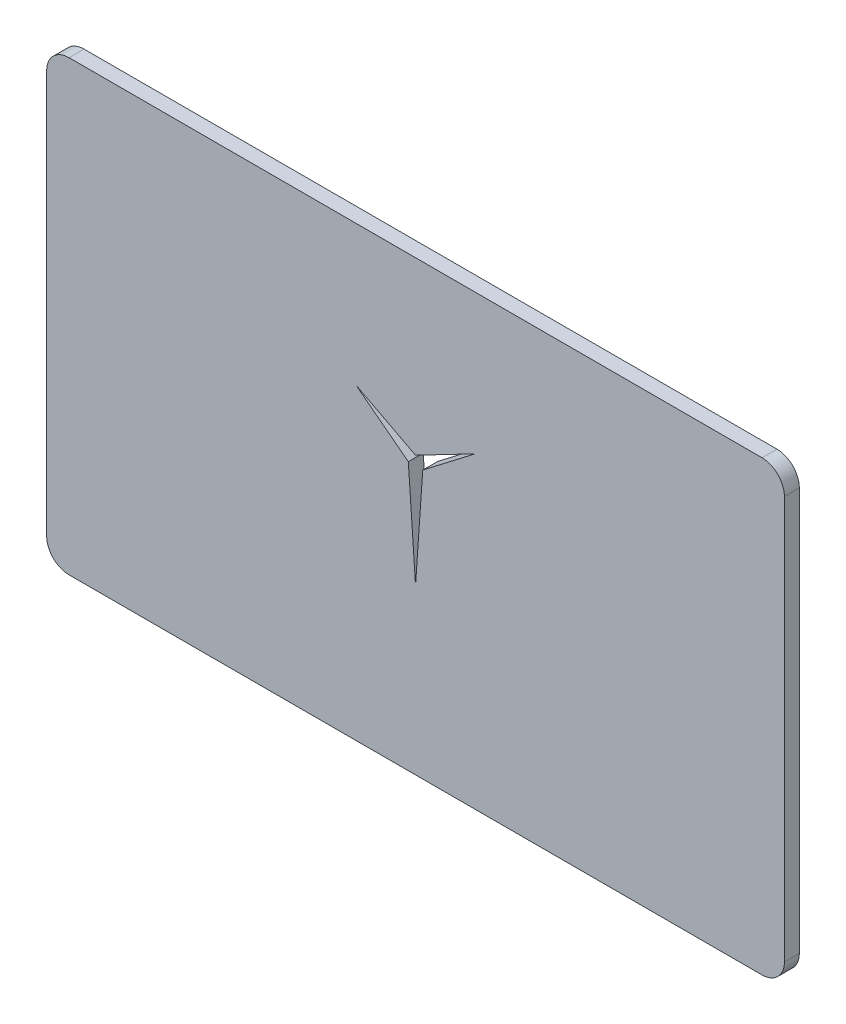
ISO-10303-21;
HEADER;
FILE_DESCRIPTION(('STEP AP214'),'2;1');
FILE_NAME('part.step','',(''),(''),'','','');
FILE_SCHEMA(('AUTOMOTIVE_DESIGN { 1 0 10303 214 1 1 1 1 }'));
ENDSEC;
DATA;
#1=APPLICATION_CONTEXT('core data for automotive mechanical design processes');
#2=APPLICATION_PROTOCOL_DEFINITION('international standard','automotive_design',2000,#1);
#3=PRODUCT_CONTEXT('',#1,'mechanical');
#4=PRODUCT('Part','Part','',(#3));
#5=PRODUCT_RELATED_PRODUCT_CATEGORY('part','',(#4));
#6=PRODUCT_DEFINITION_FORMATION('','',#4);
#7=PRODUCT_DEFINITION_CONTEXT('part definition',#1,'design');
#8=PRODUCT_DEFINITION('design','',#6,#7);
#9=PRODUCT_DEFINITION_SHAPE('','',#8);
#10=(LENGTH_UNIT() NAMED_UNIT(*) SI_UNIT(.MILLI.,.METRE.));
#11=(NAMED_UNIT(*) PLANE_ANGLE_UNIT() SI_UNIT($,.RADIAN.));
#12=(NAMED_UNIT(*) SI_UNIT($,.STERADIAN.) SOLID_ANGLE_UNIT());
#13=UNCERTAINTY_MEASURE_WITH_UNIT(LENGTH_MEASURE(1.E-05),#10,'distance_accuracy_value','');
#14=(GEOMETRIC_REPRESENTATION_CONTEXT(3) GLOBAL_UNCERTAINTY_ASSIGNED_CONTEXT((#13)) GLOBAL_UNIT_ASSIGNED_CONTEXT((#10,
#11,#12)) REPRESENTATION_CONTEXT('',''));
#15=CARTESIAN_POINT('',(0.,0.,0.));
#16=DIRECTION('',(0.,0.,1.));
#17=DIRECTION('',(1.,0.,0.));
#18=AXIS2_PLACEMENT_3D('',#15,#16,#17);
#19=CARTESIAN_POINT('',(46.4145526682122,27.,2.));
#20=DIRECTION('',(0.,0.,-1.));
#21=DIRECTION('',(-1.,0.,0.));
#22=AXIS2_PLACEMENT_3D('',#19,#20,#21);
#23=PLANE('',#22);
#24=CARTESIAN_POINT('',(46.4145526682122,27.,2.));
#25=DIRECTION('',(0.,0.,1.));
#26=DIRECTION('',(-1.,0.,0.));
#27=AXIS2_PLACEMENT_3D('',#24,#25,#26);
#28=CIRCLE('',#27,3.);
#29=CARTESIAN_POINT('',(49.4145526682122,27.,2.));
#30=VERTEX_POINT('',#29);
#31=CARTESIAN_POINT('',(46.4145526682122,30.,2.));
#32=VERTEX_POINT('',#31);
#33=EDGE_CURVE('E210',#30,#32,#28,.T.);
#34=ORIENTED_EDGE('',*,*,#33,.T.);
#35=DIRECTION('',(-1.,0.,0.));
#36=VECTOR('',#35,1.);
#37=CARTESIAN_POINT('',(-46.4145526682122,30.,2.));
#38=LINE('',#37,#36);
#39=CARTESIAN_POINT('',(-46.4145526682122,30.,2.));
#40=VERTEX_POINT('',#39);
#41=EDGE_CURVE('E214',#32,#40,#38,.T.);
#42=ORIENTED_EDGE('',*,*,#41,.T.);
#43=CARTESIAN_POINT('',(-46.4145526682122,27.,2.));
#44=DIRECTION('',(0.,0.,1.));
#45=DIRECTION('',(1.,0.,0.));
#46=AXIS2_PLACEMENT_3D('',#43,#44,#45);
#47=CIRCLE('',#46,3.);
#48=CARTESIAN_POINT('',(-49.4145526682122,27.,2.));
#49=VERTEX_POINT('',#48);
#50=EDGE_CURVE('E218',#40,#49,#47,.T.);
#51=ORIENTED_EDGE('',*,*,#50,.T.);
#52=DIRECTION('',(0.,-1.,0.));
#53=VECTOR('',#52,1.);
#54=CARTESIAN_POINT('',(-49.4145526682122,27.,2.));
#55=LINE('',#54,#53);
#56=CARTESIAN_POINT('',(-49.4145526682122,-27.,2.));
#57=VERTEX_POINT('',#56);
#58=EDGE_CURVE('E221',#49,#57,#55,.T.);
#59=ORIENTED_EDGE('',*,*,#58,.T.);
#60=CARTESIAN_POINT('',(-46.4145526682122,-27.,2.));
#61=DIRECTION('',(0.,0.,1.));
#62=DIRECTION('',(1.,0.,0.));
#63=AXIS2_PLACEMENT_3D('',#60,#61,#62);
#64=CIRCLE('',#63,3.);
#65=CARTESIAN_POINT('',(-46.4145526682122,-30.,2.));
#66=VERTEX_POINT('',#65);
#67=EDGE_CURVE('E224',#57,#66,#64,.T.);
#68=ORIENTED_EDGE('',*,*,#67,.T.);
#69=DIRECTION('',(1.,0.,0.));
#70=VECTOR('',#69,1.);
#71=CARTESIAN_POINT('',(-46.4145526682122,-30.,2.));
#72=LINE('',#71,#70);
#73=CARTESIAN_POINT('',(46.4145526682122,-30.,2.));
#74=VERTEX_POINT('',#73);
#75=EDGE_CURVE('E227',#66,#74,#72,.T.);
#76=ORIENTED_EDGE('',*,*,#75,.T.);
#77=CARTESIAN_POINT('',(46.4145526682122,-27.,2.));
#78=DIRECTION('',(0.,0.,1.));
#79=DIRECTION('',(1.,0.,0.));
#80=AXIS2_PLACEMENT_3D('',#77,#78,#79);
#81=CIRCLE('',#80,3.);
#82=CARTESIAN_POINT('',(49.4145526682122,-27.,2.));
#83=VERTEX_POINT('',#82);
#84=EDGE_CURVE('E230',#74,#83,#81,.T.);
#85=ORIENTED_EDGE('',*,*,#84,.T.);
#86=DIRECTION('',(0.,1.,0.));
#87=VECTOR('',#86,1.);
#88=CARTESIAN_POINT('',(49.4145526682122,27.,2.));
#89=LINE('',#88,#87);
#90=EDGE_CURVE('E233',#83,#30,#89,.T.);
#91=ORIENTED_EDGE('',*,*,#90,.T.);
#92=EDGE_LOOP('',(#34,#42,#51,#59,#68,#76,#85,#91));
#93=FACE_BOUND('',#92,.T.);
#94=DIRECTION('',(0.0697564737441251,0.997564050259824,0.));
#95=VECTOR('',#94,1.);
#96=CARTESIAN_POINT('',(0.,-8.,2.));
#97=LINE('',#96,#95);
#98=CARTESIAN_POINT('',(0.,-8.,2.));
#99=VERTEX_POINT('',#98);
#100=CARTESIAN_POINT('',(0.968825209862294,5.85484598732953,2.));
#101=VERTEX_POINT('',#100);
#102=EDGE_CURVE('E141',#99,#101,#97,.T.);
#103=ORIENTED_EDGE('',*,*,#102,.F.);
#104=DIRECTION('',(0.0697564737441254,-0.997564050259824,0.));
#105=VECTOR('',#104,1.);
#106=CARTESIAN_POINT('',(0.,-8.,2.));
#107=LINE('',#106,#105);
#108=CARTESIAN_POINT('',(-0.96882520986228,5.85484598732952,2.));
#109=VERTEX_POINT('',#108);
#110=EDGE_CURVE('E176',#109,#99,#107,.T.);
#111=ORIENTED_EDGE('',*,*,#110,.F.);
#112=DIRECTION('',(0.793353340291236,-0.608761429008719,0.));
#113=VECTOR('',#112,1.);
#114=CARTESIAN_POINT('',(-8.,11.2500561609995,2.));
#115=LINE('',#114,#113);
#116=CARTESIAN_POINT('',(-8.,11.2500561609995,2.));
#117=VERTEX_POINT('',#116);
#118=EDGE_CURVE('E173',#117,#109,#115,.T.);
#119=ORIENTED_EDGE('',*,*,#118,.F.);
#120=DIRECTION('',(-0.887010833178223,0.461748613235032,0.));
#121=VECTOR('',#120,1.);
#122=CARTESIAN_POINT('',(-8.,11.2500561609995,2.));
#123=LINE('',#122,#121);
#124=CARTESIAN_POINT('',(0.,7.08551975658553,2.));
#125=VERTEX_POINT('',#124);
#126=EDGE_CURVE('E168',#125,#117,#123,.T.);
#127=ORIENTED_EDGE('',*,*,#126,.F.);
#128=DIRECTION('',(-0.887010833178223,-0.461748613235032,0.));
#129=VECTOR('',#128,1.);
#130=CARTESIAN_POINT('',(8.,11.2500561609995,2.));
#131=LINE('',#130,#129);
#132=CARTESIAN_POINT('',(8.,11.2500561609995,2.));
#133=VERTEX_POINT('',#132);
#134=EDGE_CURVE('E164',#133,#125,#131,.T.);
#135=ORIENTED_EDGE('',*,*,#134,.F.);
#136=DIRECTION('',(0.793353340291236,0.608761429008719,0.));
#137=VECTOR('',#136,1.);
#138=CARTESIAN_POINT('',(8.,11.2500561609995,2.));
#139=LINE('',#138,#137);
#140=EDGE_CURVE('E150',#101,#133,#139,.T.);
#141=ORIENTED_EDGE('',*,*,#140,.F.);
#142=EDGE_LOOP('',(#103,#111,#119,#127,#135,#141));
#143=FACE_BOUND('',#142,.T.);
#144=ADVANCED_FACE('F39',(#93,#143),#23,.F.);
#145=CARTESIAN_POINT('',(46.4145526682122,27.,0.));
#146=DIRECTION('',(0.,0.,-1.));
#147=DIRECTION('',(-1.,0.,0.));
#148=AXIS2_PLACEMENT_3D('',#145,#146,#147);
#149=PLANE('',#148);
#150=CARTESIAN_POINT('',(46.4145526682122,27.,0.));
#151=DIRECTION('',(0.,0.,1.));
#152=DIRECTION('',(-1.,0.,0.));
#153=AXIS2_PLACEMENT_3D('',#150,#151,#152);
#154=CIRCLE('',#153,3.);
#155=CARTESIAN_POINT('',(49.4145526682122,27.,0.));
#156=VERTEX_POINT('',#155);
#157=CARTESIAN_POINT('',(46.4145526682122,30.,0.));
#158=VERTEX_POINT('',#157);
#159=EDGE_CURVE('E159',#156,#158,#154,.T.);
#160=ORIENTED_EDGE('',*,*,#159,.F.);
#161=DIRECTION('',(0.,1.,0.));
#162=VECTOR('',#161,1.);
#163=CARTESIAN_POINT('',(49.4145526682122,27.,0.));
#164=LINE('',#163,#162);
#165=CARTESIAN_POINT('',(49.4145526682122,-27.,0.));
#166=VERTEX_POINT('',#165);
#167=EDGE_CURVE('E215',#166,#156,#164,.T.);
#168=ORIENTED_EDGE('',*,*,#167,.F.);
#169=CARTESIAN_POINT('',(46.4145526682122,-27.,0.));
#170=DIRECTION('',(0.,0.,1.));
#171=DIRECTION('',(1.,0.,0.));
#172=AXIS2_PLACEMENT_3D('',#169,#170,#171);
#173=CIRCLE('',#172,3.);
#174=CARTESIAN_POINT('',(46.4145526682122,-30.,0.));
#175=VERTEX_POINT('',#174);
#176=EDGE_CURVE('E255',#175,#166,#173,.T.);
#177=ORIENTED_EDGE('',*,*,#176,.F.);
#178=DIRECTION('',(1.,0.,0.));
#179=VECTOR('',#178,1.);
#180=CARTESIAN_POINT('',(-46.4145526682122,-30.,0.));
#181=LINE('',#180,#179);
#182=CARTESIAN_POINT('',(-46.4145526682122,-30.,0.));
#183=VERTEX_POINT('',#182);
#184=EDGE_CURVE('E252',#183,#175,#181,.T.);
#185=ORIENTED_EDGE('',*,*,#184,.F.);
#186=CARTESIAN_POINT('',(-46.4145526682122,-27.,0.));
#187=DIRECTION('',(0.,0.,1.));
#188=DIRECTION('',(1.,0.,0.));
#189=AXIS2_PLACEMENT_3D('',#186,#187,#188);
#190=CIRCLE('',#189,3.);
#191=CARTESIAN_POINT('',(-49.4145526682122,-27.,0.));
#192=VERTEX_POINT('',#191);
#193=EDGE_CURVE('E249',#192,#183,#190,.T.);
#194=ORIENTED_EDGE('',*,*,#193,.F.);
#195=DIRECTION('',(0.,-1.,0.));
#196=VECTOR('',#195,1.);
#197=CARTESIAN_POINT('',(-49.4145526682122,27.,0.));
#198=LINE('',#197,#196);
#199=CARTESIAN_POINT('',(-49.4145526682122,27.,0.));
#200=VERTEX_POINT('',#199);
#201=EDGE_CURVE('E246',#200,#192,#198,.T.);
#202=ORIENTED_EDGE('',*,*,#201,.F.);
#203=CARTESIAN_POINT('',(-46.4145526682122,27.,0.));
#204=DIRECTION('',(0.,0.,1.));
#205=DIRECTION('',(1.,0.,0.));
#206=AXIS2_PLACEMENT_3D('',#203,#204,#205);
#207=CIRCLE('',#206,3.);
#208=CARTESIAN_POINT('',(-46.4145526682122,30.,0.));
#209=VERTEX_POINT('',#208);
#210=EDGE_CURVE('E243',#209,#200,#207,.T.);
#211=ORIENTED_EDGE('',*,*,#210,.F.);
#212=DIRECTION('',(-1.,0.,0.));
#213=VECTOR('',#212,1.);
#214=CARTESIAN_POINT('',(-46.4145526682122,30.,0.));
#215=LINE('',#214,#213);
#216=EDGE_CURVE('E240',#158,#209,#215,.T.);
#217=ORIENTED_EDGE('',*,*,#216,.F.);
#218=EDGE_LOOP('',(#160,#168,#177,#185,#194,#202,#211,#217));
#219=FACE_BOUND('',#218,.T.);
#220=DIRECTION('',(0.0697564737441254,-0.997564050259824,0.));
#221=VECTOR('',#220,1.);
#222=CARTESIAN_POINT('',(0.,-8.,0.));
#223=LINE('',#222,#221);
#224=CARTESIAN_POINT('',(-0.968825209862288,5.85484598732953,0.));
#225=VERTEX_POINT('',#224);
#226=CARTESIAN_POINT('',(0.,-8.,0.));
#227=VERTEX_POINT('',#226);
#228=EDGE_CURVE('E151',#225,#227,#223,.T.);
#229=ORIENTED_EDGE('',*,*,#228,.T.);
#230=DIRECTION('',(0.0697564737441251,0.997564050259824,0.));
#231=VECTOR('',#230,1.);
#232=CARTESIAN_POINT('',(0.,-8.,0.));
#233=LINE('',#232,#231);
#234=CARTESIAN_POINT('',(0.968825209862294,5.85484598732953,0.));
#235=VERTEX_POINT('',#234);
#236=EDGE_CURVE('E63',#227,#235,#233,.T.);
#237=ORIENTED_EDGE('',*,*,#236,.T.);
#238=DIRECTION('',(0.793353340291236,0.608761429008719,0.));
#239=VECTOR('',#238,1.);
#240=CARTESIAN_POINT('',(8.,11.2500561609995,0.));
#241=LINE('',#240,#239);
#242=CARTESIAN_POINT('',(8.,11.2500561609995,0.));
#243=VERTEX_POINT('',#242);
#244=EDGE_CURVE('E157',#235,#243,#241,.T.);
#245=ORIENTED_EDGE('',*,*,#244,.T.);
#246=DIRECTION('',(-0.887010833178223,-0.461748613235032,0.));
#247=VECTOR('',#246,1.);
#248=CARTESIAN_POINT('',(8.,11.2500561609995,0.));
#249=LINE('',#248,#247);
#250=CARTESIAN_POINT('',(0.,7.08551975658553,0.));
#251=VERTEX_POINT('',#250);
#252=EDGE_CURVE('E183',#243,#251,#249,.T.);
#253=ORIENTED_EDGE('',*,*,#252,.T.);
#254=DIRECTION('',(-0.887010833178223,0.461748613235032,0.));
#255=VECTOR('',#254,1.);
#256=CARTESIAN_POINT('',(-8.,11.2500561609995,0.));
#257=LINE('',#256,#255);
#258=CARTESIAN_POINT('',(-8.,11.2500561609995,0.));
#259=VERTEX_POINT('',#258);
#260=EDGE_CURVE('E187',#251,#259,#257,.T.);
#261=ORIENTED_EDGE('',*,*,#260,.T.);
#262=DIRECTION('',(0.793353340291236,-0.608761429008719,0.));
#263=VECTOR('',#262,1.);
#264=CARTESIAN_POINT('',(-8.,11.2500561609995,0.));
#265=LINE('',#264,#263);
#266=EDGE_CURVE('E191',#259,#225,#265,.T.);
#267=ORIENTED_EDGE('',*,*,#266,.T.);
#268=EDGE_LOOP('',(#229,#237,#245,#253,#261,#267));
#269=FACE_BOUND('',#268,.T.);
#270=ADVANCED_FACE('F294',(#219,#269),#149,.T.);
#271=CARTESIAN_POINT('',(46.4145526682122,27.,2.));
#272=DIRECTION('',(0.,0.,-1.));
#273=DIRECTION('',(-1.,0.,0.));
#274=AXIS2_PLACEMENT_3D('',#271,#272,#273);
#275=CYLINDRICAL_SURFACE('',#274,3.);
#276=ORIENTED_EDGE('',*,*,#159,.T.);
#277=DIRECTION('',(0.,0.,-1.));
#278=VECTOR('',#277,1.);
#279=CARTESIAN_POINT('',(46.4145526682122,30.,2.));
#280=LINE('',#279,#278);
#281=EDGE_CURVE('E11',#32,#158,#280,.T.);
#282=ORIENTED_EDGE('',*,*,#281,.F.);
#283=ORIENTED_EDGE('',*,*,#33,.F.);
#284=DIRECTION('',(0.,0.,-1.));
#285=VECTOR('',#284,1.);
#286=CARTESIAN_POINT('',(49.4145526682122,27.,2.));
#287=LINE('',#286,#285);
#288=EDGE_CURVE('E236',#30,#156,#287,.T.);
#289=ORIENTED_EDGE('',*,*,#288,.T.);
#290=EDGE_LOOP('',(#276,#282,#283,#289));
#291=FACE_BOUND('',#290,.T.);
#292=ADVANCED_FACE('F41',(#291),#275,.T.);
#293=CARTESIAN_POINT('',(-46.4145526682122,30.,2.));
#294=DIRECTION('',(0.,-1.,0.));
#295=DIRECTION('',(0.,0.,-1.));
#296=AXIS2_PLACEMENT_3D('',#293,#294,#295);
#297=PLANE('',#296);
#298=ORIENTED_EDGE('',*,*,#216,.T.);
#299=DIRECTION('',(0.,0.,-1.));
#300=VECTOR('',#299,1.);
#301=CARTESIAN_POINT('',(-46.4145526682122,30.,2.));
#302=LINE('',#301,#300);
#303=EDGE_CURVE('E48',#40,#209,#302,.T.);
#304=ORIENTED_EDGE('',*,*,#303,.F.);
#305=ORIENTED_EDGE('',*,*,#41,.F.);
#306=ORIENTED_EDGE('',*,*,#281,.T.);
#307=EDGE_LOOP('',(#298,#304,#305,#306));
#308=FACE_BOUND('',#307,.T.);
#309=ADVANCED_FACE('F311',(#308),#297,.F.);
#310=CARTESIAN_POINT('',(-46.4145526682122,27.,2.));
#311=DIRECTION('',(0.,0.,-1.));
#312=DIRECTION('',(-1.,0.,0.));
#313=AXIS2_PLACEMENT_3D('',#310,#311,#312);
#314=CYLINDRICAL_SURFACE('',#313,3.);
#315=ORIENTED_EDGE('',*,*,#210,.T.);
#316=DIRECTION('',(0.,0.,-1.));
#317=VECTOR('',#316,1.);
#318=CARTESIAN_POINT('',(-49.4145526682122,27.,2.));
#319=LINE('',#318,#317);
#320=EDGE_CURVE('E279',#49,#200,#319,.T.);
#321=ORIENTED_EDGE('',*,*,#320,.F.);
#322=ORIENTED_EDGE('',*,*,#50,.F.);
#323=ORIENTED_EDGE('',*,*,#303,.T.);
#324=EDGE_LOOP('',(#315,#321,#322,#323));
#325=FACE_BOUND('',#324,.T.);
#326=ADVANCED_FACE('F288',(#325),#314,.T.);
#327=CARTESIAN_POINT('',(-49.4145526682122,27.,2.));
#328=DIRECTION('',(1.,0.,0.));
#329=DIRECTION('',(0.,0.,-1.));
#330=AXIS2_PLACEMENT_3D('',#327,#328,#329);
#331=PLANE('',#330);
#332=ORIENTED_EDGE('',*,*,#201,.T.);
#333=DIRECTION('',(0.,0.,-1.));
#334=VECTOR('',#333,1.);
#335=CARTESIAN_POINT('',(-49.4145526682122,-27.,2.));
#336=LINE('',#335,#334);
#337=EDGE_CURVE('E275',#57,#192,#336,.T.);
#338=ORIENTED_EDGE('',*,*,#337,.F.);
#339=ORIENTED_EDGE('',*,*,#58,.F.);
#340=ORIENTED_EDGE('',*,*,#320,.T.);
#341=EDGE_LOOP('',(#332,#338,#339,#340));
#342=FACE_BOUND('',#341,.T.);
#343=ADVANCED_FACE('F300',(#342),#331,.F.);
#344=CARTESIAN_POINT('',(-46.4145526682122,-27.,2.));
#345=DIRECTION('',(0.,0.,-1.));
#346=DIRECTION('',(-1.,0.,0.));
#347=AXIS2_PLACEMENT_3D('',#344,#345,#346);
#348=CYLINDRICAL_SURFACE('',#347,3.);
#349=ORIENTED_EDGE('',*,*,#193,.T.);
#350=DIRECTION('',(0.,0.,-1.));
#351=VECTOR('',#350,1.);
#352=CARTESIAN_POINT('',(-46.4145526682122,-30.,2.));
#353=LINE('',#352,#351);
#354=EDGE_CURVE('E271',#66,#183,#353,.T.);
#355=ORIENTED_EDGE('',*,*,#354,.F.);
#356=ORIENTED_EDGE('',*,*,#67,.F.);
#357=ORIENTED_EDGE('',*,*,#337,.T.);
#358=EDGE_LOOP('',(#349,#355,#356,#357));
#359=FACE_BOUND('',#358,.T.);
#360=ADVANCED_FACE('F304',(#359),#348,.T.);
#361=CARTESIAN_POINT('',(-46.4145526682122,-30.,2.));
#362=DIRECTION('',(0.,1.,0.));
#363=DIRECTION('',(0.,0.,1.));
#364=AXIS2_PLACEMENT_3D('',#361,#362,#363);
#365=PLANE('',#364);
#366=ORIENTED_EDGE('',*,*,#184,.T.);
#367=DIRECTION('',(0.,0.,-1.));
#368=VECTOR('',#367,1.);
#369=CARTESIAN_POINT('',(46.4145526682122,-30.,2.));
#370=LINE('',#369,#368);
#371=EDGE_CURVE('E267',#74,#175,#370,.T.);
#372=ORIENTED_EDGE('',*,*,#371,.F.);
#373=ORIENTED_EDGE('',*,*,#75,.F.);
#374=ORIENTED_EDGE('',*,*,#354,.T.);
#375=EDGE_LOOP('',(#366,#372,#373,#374));
#376=FACE_BOUND('',#375,.T.);
#377=ADVANCED_FACE('F324',(#376),#365,.F.);
#378=CARTESIAN_POINT('',(46.4145526682122,-27.,2.));
#379=DIRECTION('',(0.,0.,-1.));
#380=DIRECTION('',(-1.,0.,0.));
#381=AXIS2_PLACEMENT_3D('',#378,#379,#380);
#382=CYLINDRICAL_SURFACE('',#381,3.);
#383=ORIENTED_EDGE('',*,*,#176,.T.);
#384=DIRECTION('',(0.,0.,-1.));
#385=VECTOR('',#384,1.);
#386=CARTESIAN_POINT('',(49.4145526682122,-27.,2.));
#387=LINE('',#386,#385);
#388=EDGE_CURVE('E263',#83,#166,#387,.T.);
#389=ORIENTED_EDGE('',*,*,#388,.F.);
#390=ORIENTED_EDGE('',*,*,#84,.F.);
#391=ORIENTED_EDGE('',*,*,#371,.T.);
#392=EDGE_LOOP('',(#383,#389,#390,#391));
#393=FACE_BOUND('',#392,.T.);
#394=ADVANCED_FACE('F322',(#393),#382,.T.);
#395=CARTESIAN_POINT('',(49.4145526682122,27.,2.));
#396=DIRECTION('',(-1.,0.,0.));
#397=DIRECTION('',(0.,0.,1.));
#398=AXIS2_PLACEMENT_3D('',#395,#396,#397);
#399=PLANE('',#398);
#400=ORIENTED_EDGE('',*,*,#167,.T.);
#401=ORIENTED_EDGE('',*,*,#288,.F.);
#402=ORIENTED_EDGE('',*,*,#90,.F.);
#403=ORIENTED_EDGE('',*,*,#388,.T.);
#404=EDGE_LOOP('',(#400,#401,#402,#403));
#405=FACE_BOUND('',#404,.T.);
#406=ADVANCED_FACE('F317',(#405),#399,.F.);
#407=CARTESIAN_POINT('',(0.,-8.,2.));
#408=DIRECTION('',(-0.997564050259824,0.0697564737441251,0.));
#409=DIRECTION('',(-0.0697564737441251,-0.997564050259824,0.));
#410=AXIS2_PLACEMENT_3D('',#407,#408,#409);
#411=PLANE('',#410);
#412=ORIENTED_EDGE('',*,*,#236,.F.);
#413=DIRECTION('',(0.,0.,-1.));
#414=VECTOR('',#413,1.);
#415=CARTESIAN_POINT('',(0.,-8.,2.));
#416=LINE('',#415,#414);
#417=EDGE_CURVE('E145',#99,#227,#416,.T.);
#418=ORIENTED_EDGE('',*,*,#417,.F.);
#419=ORIENTED_EDGE('',*,*,#102,.T.);
#420=DIRECTION('',(0.,0.,-1.));
#421=VECTOR('',#420,1.);
#422=CARTESIAN_POINT('',(0.968825209862294,5.85484598732953,2.));
#423=LINE('',#422,#421);
#424=EDGE_CURVE('E144',#101,#235,#423,.T.);
#425=ORIENTED_EDGE('',*,*,#424,.T.);
#426=EDGE_LOOP('',(#412,#418,#419,#425));
#427=FACE_BOUND('',#426,.T.);
#428=ADVANCED_FACE('F143',(#427),#411,.T.);
#429=CARTESIAN_POINT('',(8.,11.2500561609995,2.));
#430=DIRECTION('',(-0.608761429008719,0.793353340291236,0.));
#431=DIRECTION('',(-0.793353340291236,-0.608761429008719,0.));
#432=AXIS2_PLACEMENT_3D('',#429,#430,#431);
#433=PLANE('',#432);
#434=ORIENTED_EDGE('',*,*,#244,.F.);
#435=ORIENTED_EDGE('',*,*,#424,.F.);
#436=ORIENTED_EDGE('',*,*,#140,.T.);
#437=DIRECTION('',(0.,0.,-1.));
#438=VECTOR('',#437,1.);
#439=CARTESIAN_POINT('',(8.,11.2500561609995,2.));
#440=LINE('',#439,#438);
#441=EDGE_CURVE('E160',#133,#243,#440,.T.);
#442=ORIENTED_EDGE('',*,*,#441,.T.);
#443=EDGE_LOOP('',(#434,#435,#436,#442));
#444=FACE_BOUND('',#443,.T.);
#445=ADVANCED_FACE('F154',(#444),#433,.T.);
#446=CARTESIAN_POINT('',(8.,11.2500561609995,2.));
#447=DIRECTION('',(0.461748613235032,-0.887010833178223,0.));
#448=DIRECTION('',(0.887010833178223,0.461748613235032,0.));
#449=AXIS2_PLACEMENT_3D('',#446,#447,#448);
#450=PLANE('',#449);
#451=ORIENTED_EDGE('',*,*,#252,.F.);
#452=ORIENTED_EDGE('',*,*,#441,.F.);
#453=ORIENTED_EDGE('',*,*,#134,.T.);
#454=DIRECTION('',(0.,0.,-1.));
#455=VECTOR('',#454,1.);
#456=CARTESIAN_POINT('',(0.,7.08551975658553,2.));
#457=LINE('',#456,#455);
#458=EDGE_CURVE('E205',#125,#251,#457,.T.);
#459=ORIENTED_EDGE('',*,*,#458,.T.);
#460=EDGE_LOOP('',(#451,#452,#453,#459));
#461=FACE_BOUND('',#460,.T.);
#462=ADVANCED_FACE('F349',(#461),#450,.T.);
#463=CARTESIAN_POINT('',(-8.,11.2500561609995,2.));
#464=DIRECTION('',(-0.461748613235032,-0.887010833178223,0.));
#465=DIRECTION('',(0.887010833178223,-0.461748613235032,0.));
#466=AXIS2_PLACEMENT_3D('',#463,#464,#465);
#467=PLANE('',#466);
#468=ORIENTED_EDGE('',*,*,#260,.F.);
#469=ORIENTED_EDGE('',*,*,#458,.F.);
#470=ORIENTED_EDGE('',*,*,#126,.T.);
#471=DIRECTION('',(0.,0.,-1.));
#472=VECTOR('',#471,1.);
#473=CARTESIAN_POINT('',(-8.,11.2500561609995,2.));
#474=LINE('',#473,#472);
#475=EDGE_CURVE('E202',#117,#259,#474,.T.);
#476=ORIENTED_EDGE('',*,*,#475,.T.);
#477=EDGE_LOOP('',(#468,#469,#470,#476));
#478=FACE_BOUND('',#477,.T.);
#479=ADVANCED_FACE('F353',(#478),#467,.T.);
#480=CARTESIAN_POINT('',(-8.,11.2500561609995,2.));
#481=DIRECTION('',(0.608761429008719,0.793353340291236,0.));
#482=DIRECTION('',(-0.793353340291236,0.608761429008719,0.));
#483=AXIS2_PLACEMENT_3D('',#480,#481,#482);
#484=PLANE('',#483);
#485=ORIENTED_EDGE('',*,*,#266,.F.);
#486=ORIENTED_EDGE('',*,*,#475,.F.);
#487=ORIENTED_EDGE('',*,*,#118,.T.);
#488=DIRECTION('',(0.,0.,-1.));
#489=VECTOR('',#488,1.);
#490=CARTESIAN_POINT('',(-0.968825209862288,5.85484598732953,2.));
#491=LINE('',#490,#489);
#492=EDGE_CURVE('E55',#109,#225,#491,.T.);
#493=ORIENTED_EDGE('',*,*,#492,.T.);
#494=EDGE_LOOP('',(#485,#486,#487,#493));
#495=FACE_BOUND('',#494,.T.);
#496=ADVANCED_FACE('F359',(#495),#484,.T.);
#497=CARTESIAN_POINT('',(0.,-8.,2.));
#498=DIRECTION('',(0.997564050259824,0.0697564737441254,0.));
#499=DIRECTION('',(-0.0697564737441254,0.997564050259824,0.));
#500=AXIS2_PLACEMENT_3D('',#497,#498,#499);
#501=PLANE('',#500);
#502=ORIENTED_EDGE('',*,*,#228,.F.);
#503=ORIENTED_EDGE('',*,*,#492,.F.);
#504=ORIENTED_EDGE('',*,*,#110,.T.);
#505=ORIENTED_EDGE('',*,*,#417,.T.);
#506=EDGE_LOOP('',(#502,#503,#504,#505));
#507=FACE_BOUND('',#506,.T.);
#508=ADVANCED_FACE('F363',(#507),#501,.T.);
#509=CLOSED_SHELL('',(#144,#270,#292,#309,#326,#343,#360,#377,#394,#406,#428,#445,#462,#479,
#496,#508));
#510=MANIFOLD_SOLID_BREP('B2',#509);
#511=ADVANCED_BREP_SHAPE_REPRESENTATION('',(#18,#510),#14);
#512=SHAPE_DEFINITION_REPRESENTATION(#9,#511);
ENDSEC;
END-ISO-10303-21;
